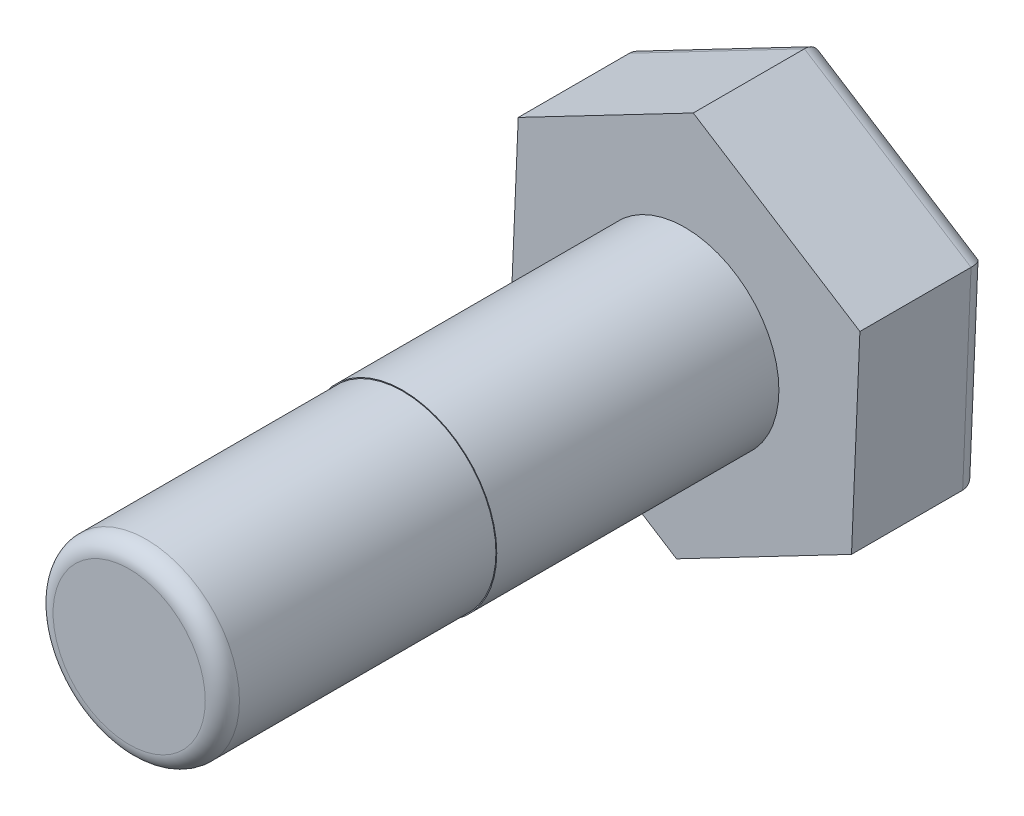
ISO-10303-21;
HEADER;
FILE_DESCRIPTION(('STEP AP214'),'2;1');
FILE_NAME('part.step','',(''),(''),'','','');
FILE_SCHEMA(('AUTOMOTIVE_DESIGN { 1 0 10303 214 1 1 1 1 }'));
ENDSEC;
DATA;
#1=APPLICATION_CONTEXT('core data for automotive mechanical design processes');
#2=APPLICATION_PROTOCOL_DEFINITION('international standard','automotive_design',2000,#1);
#3=PRODUCT_CONTEXT('',#1,'mechanical');
#4=PRODUCT('Part','Part','',(#3));
#5=PRODUCT_RELATED_PRODUCT_CATEGORY('part','',(#4));
#6=PRODUCT_DEFINITION_FORMATION('','',#4);
#7=PRODUCT_DEFINITION_CONTEXT('part definition',#1,'design');
#8=PRODUCT_DEFINITION('design','',#6,#7);
#9=PRODUCT_DEFINITION_SHAPE('','',#8);
#10=(LENGTH_UNIT() NAMED_UNIT(*) SI_UNIT(.MILLI.,.METRE.));
#11=(NAMED_UNIT(*) PLANE_ANGLE_UNIT() SI_UNIT($,.RADIAN.));
#12=(NAMED_UNIT(*) SI_UNIT($,.STERADIAN.) SOLID_ANGLE_UNIT());
#13=UNCERTAINTY_MEASURE_WITH_UNIT(LENGTH_MEASURE(1.E-05),#10,'distance_accuracy_value','');
#14=(GEOMETRIC_REPRESENTATION_CONTEXT(3) GLOBAL_UNCERTAINTY_ASSIGNED_CONTEXT((#13)) GLOBAL_UNIT_ASSIGNED_CONTEXT((#10,
#11,#12)) REPRESENTATION_CONTEXT('',''));
#15=CARTESIAN_POINT('',(0.,0.,0.));
#16=DIRECTION('',(0.,0.,1.));
#17=DIRECTION('',(1.,0.,0.));
#18=AXIS2_PLACEMENT_3D('',#15,#16,#17);
#19=CARTESIAN_POINT('',(0.,0.,48.));
#20=DIRECTION('',(0.,0.,1.));
#21=DIRECTION('',(1.,0.,0.));
#22=AXIS2_PLACEMENT_3D('',#19,#20,#21);
#23=PLANE('',#22);
#24=CARTESIAN_POINT('',(0.,0.,48.));
#25=DIRECTION('',(0.,0.,1.));
#26=DIRECTION('',(1.,0.,0.));
#27=AXIS2_PLACEMENT_3D('',#24,#25,#26);
#28=CIRCLE('',#27,11.);
#29=CARTESIAN_POINT('',(11.,0.,48.));
#30=VERTEX_POINT('',#29);
#31=EDGE_CURVE('E130',#30,#30,#28,.T.);
#32=ORIENTED_EDGE('',*,*,#31,.T.);
#33=EDGE_LOOP('',(#32));
#34=FACE_BOUND('',#33,.T.);
#35=CARTESIAN_POINT('',(0.,0.,48.));
#36=DIRECTION('',(0.,0.,1.));
#37=DIRECTION('',(1.,0.,0.));
#38=AXIS2_PLACEMENT_3D('',#35,#36,#37);
#39=CIRCLE('',#38,10.9);
#40=CARTESIAN_POINT('',(10.9,0.,48.));
#41=VERTEX_POINT('',#40);
#42=EDGE_CURVE('E165',#41,#41,#39,.T.);
#43=ORIENTED_EDGE('',*,*,#42,.F.);
#44=EDGE_LOOP('',(#43));
#45=FACE_BOUND('',#44,.T.);
#46=ADVANCED_FACE('F37',(#34,#45),#23,.T.);
#47=CARTESIAN_POINT('',(19.4915119627059,-12.3860524276714,15.));
#48=DIRECTION('',(-0.999097599975706,0.0424733530908878,0.));
#49=DIRECTION('',(-0.0424733530908878,-0.999097599975706,0.));
#50=AXIS2_PLACEMENT_3D('',#47,#48,#49);
#51=PLANE('',#50);
#52=DIRECTION('',(0.,0.,-1.));
#53=VECTOR('',#52,1.);
#54=CARTESIAN_POINT('',(19.4915119627059,-12.3860524276714,15.));
#55=LINE('',#54,#53);
#56=CARTESIAN_POINT('',(19.4915119627059,-12.3860524276714,15.));
#57=VERTEX_POINT('',#56);
#58=CARTESIAN_POINT('',(19.4915119627059,-12.3860524276714,2.));
#59=VERTEX_POINT('',#58);
#60=EDGE_CURVE('E278',#57,#59,#55,.T.);
#61=ORIENTED_EDGE('',*,*,#60,.T.);
#62=DIRECTION('',(0.0424733530908878,0.999097599975706,0.));
#63=VECTOR('',#62,1.);
#64=CARTESIAN_POINT('',(19.4915119627059,-12.3860524276714,2.));
#65=LINE('',#64,#63);
#66=CARTESIAN_POINT('',(20.4723920363223,10.6871183040359,2.));
#67=VERTEX_POINT('',#66);
#68=EDGE_CURVE('E134',#59,#67,#65,.T.);
#69=ORIENTED_EDGE('',*,*,#68,.T.);
#70=DIRECTION('',(0.,0.,-1.));
#71=VECTOR('',#70,1.);
#72=CARTESIAN_POINT('',(20.4723920363223,10.6871183040359,15.));
#73=LINE('',#72,#71);
#74=CARTESIAN_POINT('',(20.4723920363223,10.6871183040359,15.));
#75=VERTEX_POINT('',#74);
#76=EDGE_CURVE('E116',#75,#67,#73,.T.);
#77=ORIENTED_EDGE('',*,*,#76,.F.);
#78=DIRECTION('',(0.0424733530908878,0.999097599975707,0.));
#79=VECTOR('',#78,1.);
#80=CARTESIAN_POINT('',(19.4915119627059,-12.3860524276714,15.));
#81=LINE('',#80,#79);
#82=EDGE_CURVE('E123',#57,#75,#81,.T.);
#83=ORIENTED_EDGE('',*,*,#82,.F.);
#84=EDGE_LOOP('',(#61,#69,#77,#83));
#85=FACE_BOUND('',#84,.T.);
#86=ADVANCED_FACE('F132',(#85),#51,.F.);
#87=CARTESIAN_POINT('',(20.4723920363223,10.6871183040359,15.));
#88=DIRECTION('',(-0.536331802748468,-0.844007225893581,0.));
#89=DIRECTION('',(0.844007225893581,-0.536331802748468,0.));
#90=AXIS2_PLACEMENT_3D('',#87,#88,#89);
#91=PLANE('',#90);
#92=ORIENTED_EDGE('',*,*,#76,.T.);
#93=DIRECTION('',(-0.844007225893581,0.536331802748468,0.));
#94=VECTOR('',#93,1.);
#95=CARTESIAN_POINT('',(20.4723920363223,10.6871183040359,2.));
#96=LINE('',#95,#94);
#97=CARTESIAN_POINT('',(0.980880073616411,23.0731707317073,2.));
#98=VERTEX_POINT('',#97);
#99=EDGE_CURVE('E135',#67,#98,#96,.T.);
#100=ORIENTED_EDGE('',*,*,#99,.T.);
#101=DIRECTION('',(0.,0.,-1.));
#102=VECTOR('',#101,1.);
#103=CARTESIAN_POINT('',(0.980880073616411,23.0731707317073,15.));
#104=LINE('',#103,#102);
#105=CARTESIAN_POINT('',(0.980880073616411,23.0731707317073,15.));
#106=VERTEX_POINT('',#105);
#107=EDGE_CURVE('E119',#106,#98,#104,.T.);
#108=ORIENTED_EDGE('',*,*,#107,.F.);
#109=DIRECTION('',(-0.844007225893581,0.536331802748468,0.));
#110=VECTOR('',#109,1.);
#111=CARTESIAN_POINT('',(20.4723920363223,10.6871183040359,15.));
#112=LINE('',#111,#110);
#113=EDGE_CURVE('E111',#75,#106,#112,.T.);
#114=ORIENTED_EDGE('',*,*,#113,.F.);
#115=EDGE_LOOP('',(#92,#100,#108,#114));
#116=FACE_BOUND('',#115,.T.);
#117=ADVANCED_FACE('F113',(#116),#91,.F.);
#118=CARTESIAN_POINT('',(0.980880073616411,23.0731707317073,15.));
#119=DIRECTION('',(0.462765797227238,-0.886480578984469,0.));
#120=DIRECTION('',(0.886480578984469,0.462765797227238,0.));
#121=AXIS2_PLACEMENT_3D('',#118,#119,#120);
#122=PLANE('',#121);
#123=ORIENTED_EDGE('',*,*,#107,.T.);
#124=DIRECTION('',(-0.886480578984469,-0.462765797227238,0.));
#125=VECTOR('',#124,1.);
#126=CARTESIAN_POINT('',(0.980880073616411,23.0731707317073,2.));
#127=LINE('',#126,#125);
#128=CARTESIAN_POINT('',(-19.4915119627059,12.3860524276714,2.));
#129=VERTEX_POINT('',#128);
#130=EDGE_CURVE('E155',#98,#129,#127,.T.);
#131=ORIENTED_EDGE('',*,*,#130,.T.);
#132=DIRECTION('',(0.,0.,-1.));
#133=VECTOR('',#132,1.);
#134=CARTESIAN_POINT('',(-19.4915119627059,12.3860524276714,15.));
#135=LINE('',#134,#133);
#136=CARTESIAN_POINT('',(-19.4915119627059,12.3860524276714,15.));
#137=VERTEX_POINT('',#136);
#138=EDGE_CURVE('E139',#137,#129,#135,.T.);
#139=ORIENTED_EDGE('',*,*,#138,.F.);
#140=DIRECTION('',(-0.886480578984469,-0.462765797227238,0.));
#141=VECTOR('',#140,1.);
#142=CARTESIAN_POINT('',(0.980880073616411,23.0731707317073,15.));
#143=LINE('',#142,#141);
#144=EDGE_CURVE('E122',#106,#137,#143,.T.);
#145=ORIENTED_EDGE('',*,*,#144,.F.);
#146=EDGE_LOOP('',(#123,#131,#139,#145));
#147=FACE_BOUND('',#146,.T.);
#148=ADVANCED_FACE('F224',(#147),#122,.F.);
#149=CARTESIAN_POINT('',(-19.4915119627059,12.3860524276714,15.));
#150=DIRECTION('',(0.999097599975706,-0.0424733530908877,0.));
#151=DIRECTION('',(0.0424733530908877,0.999097599975706,0.));
#152=AXIS2_PLACEMENT_3D('',#149,#150,#151);
#153=PLANE('',#152);
#154=ORIENTED_EDGE('',*,*,#138,.T.);
#155=DIRECTION('',(-0.0424733530908877,-0.999097599975706,0.));
#156=VECTOR('',#155,1.);
#157=CARTESIAN_POINT('',(-19.4915119627059,12.3860524276714,2.));
#158=LINE('',#157,#156);
#159=CARTESIAN_POINT('',(-20.4723920363223,-10.6871183040359,2.));
#160=VERTEX_POINT('',#159);
#161=EDGE_CURVE('E157',#129,#160,#158,.T.);
#162=ORIENTED_EDGE('',*,*,#161,.T.);
#163=DIRECTION('',(0.,0.,-1.));
#164=VECTOR('',#163,1.);
#165=CARTESIAN_POINT('',(-20.4723920363223,-10.6871183040359,15.));
#166=LINE('',#165,#164);
#167=CARTESIAN_POINT('',(-20.4723920363223,-10.6871183040359,15.));
#168=VERTEX_POINT('',#167);
#169=EDGE_CURVE('E282',#168,#160,#166,.T.);
#170=ORIENTED_EDGE('',*,*,#169,.F.);
#171=DIRECTION('',(-0.0424733530908877,-0.999097599975707,0.));
#172=VECTOR('',#171,1.);
#173=CARTESIAN_POINT('',(-19.4915119627059,12.3860524276714,15.));
#174=LINE('',#173,#172);
#175=EDGE_CURVE('E271',#137,#168,#174,.T.);
#176=ORIENTED_EDGE('',*,*,#175,.F.);
#177=EDGE_LOOP('',(#154,#162,#170,#176));
#178=FACE_BOUND('',#177,.T.);
#179=ADVANCED_FACE('F221',(#178),#153,.F.);
#180=CARTESIAN_POINT('',(-20.4723920363223,-10.6871183040359,15.));
#181=DIRECTION('',(0.536331802748468,0.844007225893581,0.));
#182=DIRECTION('',(-0.844007225893581,0.536331802748468,0.));
#183=AXIS2_PLACEMENT_3D('',#180,#181,#182);
#184=PLANE('',#183);
#185=ORIENTED_EDGE('',*,*,#169,.T.);
#186=DIRECTION('',(0.844007225893581,-0.536331802748468,0.));
#187=VECTOR('',#186,1.);
#188=CARTESIAN_POINT('',(-20.4723920363223,-10.6871183040359,2.));
#189=LINE('',#188,#187);
#190=CARTESIAN_POINT('',(-0.980880073616402,-23.0731707317073,2.));
#191=VERTEX_POINT('',#190);
#192=EDGE_CURVE('E60',#160,#191,#189,.T.);
#193=ORIENTED_EDGE('',*,*,#192,.T.);
#194=DIRECTION('',(0.,0.,-1.));
#195=VECTOR('',#194,1.);
#196=CARTESIAN_POINT('',(-0.980880073616402,-23.0731707317073,15.));
#197=LINE('',#196,#195);
#198=CARTESIAN_POINT('',(-0.980880073616402,-23.0731707317073,15.));
#199=VERTEX_POINT('',#198);
#200=EDGE_CURVE('E280',#199,#191,#197,.T.);
#201=ORIENTED_EDGE('',*,*,#200,.F.);
#202=DIRECTION('',(0.844007225893581,-0.536331802748469,0.));
#203=VECTOR('',#202,1.);
#204=CARTESIAN_POINT('',(-20.4723920363223,-10.6871183040359,15.));
#205=LINE('',#204,#203);
#206=EDGE_CURVE('E273',#168,#199,#205,.T.);
#207=ORIENTED_EDGE('',*,*,#206,.F.);
#208=EDGE_LOOP('',(#185,#193,#201,#207));
#209=FACE_BOUND('',#208,.T.);
#210=ADVANCED_FACE('F218',(#209),#184,.F.);
#211=CARTESIAN_POINT('',(-0.980880073616402,-23.0731707317073,15.));
#212=DIRECTION('',(-0.462765797227238,0.886480578984469,0.));
#213=DIRECTION('',(-0.886480578984469,-0.462765797227238,0.));
#214=AXIS2_PLACEMENT_3D('',#211,#212,#213);
#215=PLANE('',#214);
#216=ORIENTED_EDGE('',*,*,#200,.T.);
#217=DIRECTION('',(0.886480578984469,0.462765797227238,0.));
#218=VECTOR('',#217,1.);
#219=CARTESIAN_POINT('',(-0.980880073616402,-23.0731707317073,2.));
#220=LINE('',#219,#218);
#221=EDGE_CURVE('E52',#191,#59,#220,.T.);
#222=ORIENTED_EDGE('',*,*,#221,.T.);
#223=ORIENTED_EDGE('',*,*,#60,.F.);
#224=DIRECTION('',(0.886480578984469,0.462765797227238,0.));
#225=VECTOR('',#224,1.);
#226=CARTESIAN_POINT('',(-0.980880073616402,-23.0731707317073,15.));
#227=LINE('',#226,#225);
#228=EDGE_CURVE('E128',#199,#57,#227,.T.);
#229=ORIENTED_EDGE('',*,*,#228,.F.);
#230=EDGE_LOOP('',(#216,#222,#223,#229));
#231=FACE_BOUND('',#230,.T.);
#232=ADVANCED_FACE('F211',(#231),#215,.F.);
#233=CARTESIAN_POINT('',(21.4532721099387,33.7602890357432,15.));
#234=DIRECTION('',(0.,0.,1.));
#235=DIRECTION('',(1.,0.,0.));
#236=AXIS2_PLACEMENT_3D('',#233,#234,#235);
#237=PLANE('',#236);
#238=CARTESIAN_POINT('',(0.,0.,15.));
#239=DIRECTION('',(0.,0.,1.));
#240=DIRECTION('',(1.,0.,0.));
#241=AXIS2_PLACEMENT_3D('',#238,#239,#240);
#242=CIRCLE('',#241,11.);
#243=CARTESIAN_POINT('',(11.,0.,15.));
#244=VERTEX_POINT('',#243);
#245=EDGE_CURVE('E178',#244,#244,#242,.T.);
#246=ORIENTED_EDGE('',*,*,#245,.F.);
#247=EDGE_LOOP('',(#246));
#248=FACE_BOUND('',#247,.T.);
#249=ORIENTED_EDGE('',*,*,#82,.T.);
#250=ORIENTED_EDGE('',*,*,#113,.T.);
#251=ORIENTED_EDGE('',*,*,#144,.T.);
#252=ORIENTED_EDGE('',*,*,#175,.T.);
#253=ORIENTED_EDGE('',*,*,#206,.T.);
#254=ORIENTED_EDGE('',*,*,#228,.T.);
#255=EDGE_LOOP('',(#249,#250,#251,#252,#253,#254));
#256=FACE_BOUND('',#255,.T.);
#257=ADVANCED_FACE('F126',(#248,#256),#237,.T.);
#258=CARTESIAN_POINT('',(21.4532721099387,33.7602890357432,0.));
#259=DIRECTION('',(0.,0.,1.));
#260=DIRECTION('',(1.,0.,0.));
#261=AXIS2_PLACEMENT_3D('',#258,#259,#260);
#262=PLANE('',#261);
#263=DIRECTION('',(-0.886480578984469,-0.462765797227238,0.));
#264=VECTOR('',#263,1.);
#265=CARTESIAN_POINT('',(22.3788037043932,31.9873278777743,0.));
#266=LINE('',#265,#264);
#267=CARTESIAN_POINT('',(-17.5423607664353,11.1474471849043,0.));
#268=VERTEX_POINT('',#267);
#269=CARTESIAN_POINT('',(0.882792066254768,20.7658536585366,0.));
#270=VERTEX_POINT('',#269);
#271=EDGE_CURVE('E150',#268,#270,#266,.F.);
#272=ORIENTED_EDGE('',*,*,#271,.T.);
#273=DIRECTION('',(-0.844007225893581,0.536331802748468,0.));
#274=VECTOR('',#273,1.);
#275=CARTESIAN_POINT('',(9.65397244947244,15.1921300660844,0.));
#276=LINE('',#275,#274);
#277=CARTESIAN_POINT('',(18.4251528326901,9.61840647363232,0.));
#278=VERTEX_POINT('',#277);
#279=EDGE_CURVE('E152',#270,#278,#276,.F.);
#280=ORIENTED_EDGE('',*,*,#279,.T.);
#281=DIRECTION('',(0.0424733530908878,0.999097599975706,0.));
#282=VECTOR('',#281,1.);
#283=CARTESIAN_POINT('',(19.4550769099873,33.845235741925,0.));
#284=LINE('',#283,#282);
#285=CARTESIAN_POINT('',(17.5423607664353,-11.1474471849043,0.));
#286=VERTEX_POINT('',#285);
#287=EDGE_CURVE('E137',#278,#286,#284,.F.);
#288=ORIENTED_EDGE('',*,*,#287,.T.);
#289=DIRECTION('',(0.886480578984469,0.462765797227238,0.));
#290=VECTOR('',#289,1.);
#291=CARTESIAN_POINT('',(39.0383724045738,0.0740270343334015,0.));
#292=LINE('',#291,#290);
#293=CARTESIAN_POINT('',(-0.882792066254761,-20.7658536585366,0.));
#294=VERTEX_POINT('',#293);
#295=EDGE_CURVE('E144',#286,#294,#292,.F.);
#296=ORIENTED_EDGE('',*,*,#295,.T.);
#297=DIRECTION('',(0.844007225893581,-0.536331802748468,0.));
#298=VECTOR('',#297,1.);
#299=CARTESIAN_POINT('',(-9.65397244947243,-15.1921300660844,0.));
#300=LINE('',#299,#298);
#301=CARTESIAN_POINT('',(-18.4251528326901,-9.61840647363232,0.));
#302=VERTEX_POINT('',#301);
#303=EDGE_CURVE('E146',#294,#302,#300,.F.);
#304=ORIENTED_EDGE('',*,*,#303,.T.);
#305=DIRECTION('',(-0.0424733530908877,-0.999097599975706,0.));
#306=VECTOR('',#305,1.);
#307=CARTESIAN_POINT('',(-16.5124366891381,35.374276453197,0.));
#308=LINE('',#307,#306);
#309=EDGE_CURVE('E148',#302,#268,#308,.F.);
#310=ORIENTED_EDGE('',*,*,#309,.T.);
#311=EDGE_LOOP('',(#272,#280,#288,#296,#304,#310));
#312=FACE_BOUND('',#311,.T.);
#313=ADVANCED_FACE('F207',(#312),#262,.F.);
#314=CARTESIAN_POINT('',(0.,0.,48.));
#315=DIRECTION('',(0.,0.,-1.));
#316=DIRECTION('',(-1.,0.,0.));
#317=AXIS2_PLACEMENT_3D('',#314,#315,#316);
#318=CYLINDRICAL_SURFACE('',#317,11.);
#319=ORIENTED_EDGE('',*,*,#31,.F.);
#320=EDGE_LOOP('',(#319));
#321=FACE_BOUND('',#320,.T.);
#322=ORIENTED_EDGE('',*,*,#245,.T.);
#323=EDGE_LOOP('',(#322));
#324=FACE_BOUND('',#323,.T.);
#325=ADVANCED_FACE('F203',(#321,#324),#318,.T.);
#326=CARTESIAN_POINT('',(-19.3997284308254,-8.99910385224874,2.));
#327=DIRECTION('',(0.844007225893581,-0.536331802748468,0.));
#328=DIRECTION('',(0.536331802748468,0.844007225893581,0.));
#329=AXIS2_PLACEMENT_3D('',#326,#327,#328);
#330=CYLINDRICAL_SURFACE('',#329,2.);
#331=CARTESIAN_POINT('',(-18.4251528326901,-9.61840647363232,2.));
#332=DIRECTION('',(0.462765797227238,-0.886480578984469,0.));
#333=DIRECTION('',(0.886480578984469,0.462765797227238,0.));
#334=AXIS2_PLACEMENT_3D('',#331,#332,#333);
#335=ELLIPSE('',#334,2.3094010767585,2.);
#336=EDGE_CURVE('E173',#302,#160,#335,.F.);
#337=ORIENTED_EDGE('',*,*,#336,.F.);
#338=ORIENTED_EDGE('',*,*,#303,.F.);
#339=CARTESIAN_POINT('',(-0.882792066254761,-20.7658536585366,2.));
#340=DIRECTION('',(0.999097599975706,-0.042473353090888,0.));
#341=DIRECTION('',(0.042473353090888,0.999097599975707,0.));
#342=AXIS2_PLACEMENT_3D('',#339,#340,#341);
#343=ELLIPSE('',#342,2.3094010767585,2.);
#344=EDGE_CURVE('E176',#191,#294,#343,.T.);
#345=ORIENTED_EDGE('',*,*,#344,.F.);
#346=ORIENTED_EDGE('',*,*,#192,.F.);
#347=EDGE_LOOP('',(#337,#338,#345,#346));
#348=FACE_BOUND('',#347,.T.);
#349=ADVANCED_FACE('F206',(#348),#330,.T.);
#350=CARTESIAN_POINT('',(-1.90641166807088,-21.3002095737384,2.));
#351=DIRECTION('',(0.886480578984469,0.462765797227238,0.));
#352=DIRECTION('',(-0.462765797227238,0.886480578984469,0.));
#353=AXIS2_PLACEMENT_3D('',#350,#351,#352);
#354=CYLINDRICAL_SURFACE('',#353,2.);
#355=ORIENTED_EDGE('',*,*,#344,.T.);
#356=ORIENTED_EDGE('',*,*,#295,.F.);
#357=CARTESIAN_POINT('',(17.5423607664353,-11.1474471849043,2.));
#358=DIRECTION('',(0.536331802748468,0.844007225893581,0.));
#359=DIRECTION('',(-0.844007225893581,0.536331802748469,0.));
#360=AXIS2_PLACEMENT_3D('',#357,#358,#359);
#361=ELLIPSE('',#360,2.3094010767585,2.);
#362=EDGE_CURVE('E170',#59,#286,#361,.T.);
#363=ORIENTED_EDGE('',*,*,#362,.F.);
#364=ORIENTED_EDGE('',*,*,#221,.F.);
#365=EDGE_LOOP('',(#355,#356,#363,#364));
#366=FACE_BOUND('',#365,.T.);
#367=ADVANCED_FACE('F246',(#366),#354,.T.);
#368=CARTESIAN_POINT('',(-17.4933167627545,12.3011057214896,2.));
#369=DIRECTION('',(-0.0424733530908877,-0.999097599975706,0.));
#370=DIRECTION('',(0.999097599975706,-0.0424733530908877,0.));
#371=AXIS2_PLACEMENT_3D('',#368,#369,#370);
#372=CYLINDRICAL_SURFACE('',#371,2.);
#373=ORIENTED_EDGE('',*,*,#336,.T.);
#374=ORIENTED_EDGE('',*,*,#161,.F.);
#375=CARTESIAN_POINT('',(-17.5423607664353,11.1474471849043,2.));
#376=DIRECTION('',(-0.536331802748468,-0.844007225893581,0.));
#377=DIRECTION('',(0.844007225893581,-0.536331802748468,0.));
#378=AXIS2_PLACEMENT_3D('',#375,#376,#377);
#379=ELLIPSE('',#378,2.3094010767585,2.);
#380=EDGE_CURVE('E167',#268,#129,#379,.F.);
#381=ORIENTED_EDGE('',*,*,#380,.F.);
#382=ORIENTED_EDGE('',*,*,#309,.F.);
#383=EDGE_LOOP('',(#373,#374,#381,#382));
#384=FACE_BOUND('',#383,.T.);
#385=ADVANCED_FACE('F242',(#384),#372,.T.);
#386=CARTESIAN_POINT('',(17.4933167627545,-12.3011057214897,2.));
#387=DIRECTION('',(0.0424733530908878,0.999097599975706,0.));
#388=DIRECTION('',(-0.999097599975706,0.0424733530908878,0.));
#389=AXIS2_PLACEMENT_3D('',#386,#387,#388);
#390=CYLINDRICAL_SURFACE('',#389,2.);
#391=ORIENTED_EDGE('',*,*,#362,.T.);
#392=ORIENTED_EDGE('',*,*,#287,.F.);
#393=CARTESIAN_POINT('',(18.4251528326901,9.61840647363231,2.));
#394=DIRECTION('',(-0.462765797227238,0.886480578984469,0.));
#395=DIRECTION('',(0.886480578984469,0.462765797227238,0.));
#396=AXIS2_PLACEMENT_3D('',#393,#394,#395);
#397=ELLIPSE('',#396,2.3094010767585,2.);
#398=EDGE_CURVE('E164',#67,#278,#397,.T.);
#399=ORIENTED_EDGE('',*,*,#398,.F.);
#400=ORIENTED_EDGE('',*,*,#68,.F.);
#401=EDGE_LOOP('',(#391,#392,#399,#400));
#402=FACE_BOUND('',#401,.T.);
#403=ADVANCED_FACE('F238',(#402),#390,.T.);
#404=CARTESIAN_POINT('',(1.90641166807089,21.3002095737384,2.));
#405=DIRECTION('',(-0.886480578984469,-0.462765797227238,0.));
#406=DIRECTION('',(0.462765797227238,-0.886480578984469,0.));
#407=AXIS2_PLACEMENT_3D('',#404,#405,#406);
#408=CYLINDRICAL_SURFACE('',#407,2.);
#409=ORIENTED_EDGE('',*,*,#380,.T.);
#410=ORIENTED_EDGE('',*,*,#130,.F.);
#411=CARTESIAN_POINT('',(0.882792066254761,20.7658536585366,2.));
#412=DIRECTION('',(-0.999097599975706,0.042473353090888,0.));
#413=DIRECTION('',(-0.0424733530908879,-0.999097599975706,0.));
#414=AXIS2_PLACEMENT_3D('',#411,#412,#413);
#415=ELLIPSE('',#414,2.3094010767585,2.);
#416=EDGE_CURVE('E162',#270,#98,#415,.F.);
#417=ORIENTED_EDGE('',*,*,#416,.F.);
#418=ORIENTED_EDGE('',*,*,#271,.F.);
#419=EDGE_LOOP('',(#409,#410,#417,#418));
#420=FACE_BOUND('',#419,.T.);
#421=ADVANCED_FACE('F234',(#420),#408,.T.);
#422=CARTESIAN_POINT('',(19.3997284308254,8.99910385224875,2.));
#423=DIRECTION('',(-0.844007225893581,0.536331802748468,0.));
#424=DIRECTION('',(-0.536331802748468,-0.844007225893581,0.));
#425=AXIS2_PLACEMENT_3D('',#422,#423,#424);
#426=CYLINDRICAL_SURFACE('',#425,2.);
#427=ORIENTED_EDGE('',*,*,#398,.T.);
#428=ORIENTED_EDGE('',*,*,#279,.F.);
#429=ORIENTED_EDGE('',*,*,#416,.T.);
#430=ORIENTED_EDGE('',*,*,#99,.F.);
#431=EDGE_LOOP('',(#427,#428,#429,#430));
#432=FACE_BOUND('',#431,.T.);
#433=ADVANCED_FACE('F231',(#432),#426,.T.);
#434=CARTESIAN_POINT('',(0.,0.,80.));
#435=DIRECTION('',(0.,0.,-1.));
#436=DIRECTION('',(-1.,0.,0.));
#437=AXIS2_PLACEMENT_3D('',#434,#435,#436);
#438=CYLINDRICAL_SURFACE('',#437,10.9);
#439=CARTESIAN_POINT('',(0.,0.,78.));
#440=DIRECTION('',(0.,0.,1.));
#441=DIRECTION('',(1.,0.,0.));
#442=AXIS2_PLACEMENT_3D('',#439,#440,#441);
#443=CIRCLE('',#442,10.9);
#444=CARTESIAN_POINT('',(10.9,0.,78.));
#445=VERTEX_POINT('',#444);
#446=EDGE_CURVE('E11',#445,#445,#443,.F.);
#447=ORIENTED_EDGE('',*,*,#446,.T.);
#448=EDGE_LOOP('',(#447));
#449=FACE_BOUND('',#448,.T.);
#450=ORIENTED_EDGE('',*,*,#42,.T.);
#451=EDGE_LOOP('',(#450));
#452=FACE_BOUND('',#451,.T.);
#453=ADVANCED_FACE('F189',(#449,#452),#438,.T.);
#454=CARTESIAN_POINT('',(0.,0.,80.));
#455=DIRECTION('',(0.,0.,1.));
#456=DIRECTION('',(1.,0.,0.));
#457=AXIS2_PLACEMENT_3D('',#454,#455,#456);
#458=PLANE('',#457);
#459=CARTESIAN_POINT('',(0.,0.,80.));
#460=DIRECTION('',(0.,0.,1.));
#461=DIRECTION('',(1.,0.,0.));
#462=AXIS2_PLACEMENT_3D('',#459,#460,#461);
#463=CIRCLE('',#462,8.9);
#464=CARTESIAN_POINT('',(8.9,0.,80.));
#465=VERTEX_POINT('',#464);
#466=EDGE_CURVE('E45',#465,#465,#463,.T.);
#467=ORIENTED_EDGE('',*,*,#466,.T.);
#468=EDGE_LOOP('',(#467));
#469=FACE_BOUND('',#468,.T.);
#470=ADVANCED_FACE('F182',(#469),#458,.T.);
#471=CARTESIAN_POINT('',(0.,0.,78.));
#472=DIRECTION('',(0.,0.,1.));
#473=DIRECTION('',(1.,0.,0.));
#474=AXIS2_PLACEMENT_3D('',#471,#472,#473);
#475=TOROIDAL_SURFACE('',#474,8.9,2.);
#476=ORIENTED_EDGE('',*,*,#446,.F.);
#477=EDGE_LOOP('',(#476));
#478=FACE_BOUND('',#477,.T.);
#479=ORIENTED_EDGE('',*,*,#466,.F.);
#480=EDGE_LOOP('',(#479));
#481=FACE_BOUND('',#480,.T.);
#482=ADVANCED_FACE('F39',(#478,#481),#475,.T.);
#483=CLOSED_SHELL('',(#46,#86,#117,#148,#179,#210,#232,#257,#313,#325,#349,#367,#385,#403,#421,
#433,#453,#470,#482));
#484=MANIFOLD_SOLID_BREP('B2',#483);
#485=ADVANCED_BREP_SHAPE_REPRESENTATION('',(#18,#484),#14);
#486=SHAPE_DEFINITION_REPRESENTATION(#9,#485);
ENDSEC;
END-ISO-10303-21;
